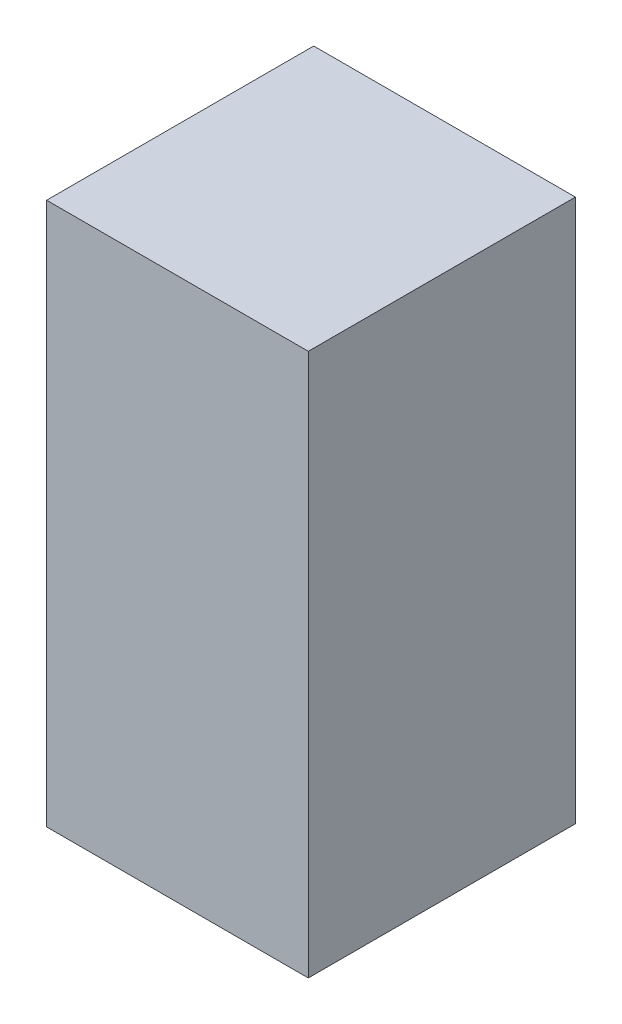
ISO-10303-21;
HEADER;
FILE_DESCRIPTION(('STEP AP214'),'2;1');
FILE_NAME('part.step','',(''),(''),'','','');
FILE_SCHEMA(('AUTOMOTIVE_DESIGN { 1 0 10303 214 1 1 1 1 }'));
ENDSEC;
DATA;
#1=APPLICATION_CONTEXT('core data for automotive mechanical design processes');
#2=APPLICATION_PROTOCOL_DEFINITION('international standard','automotive_design',2000,#1);
#3=PRODUCT_CONTEXT('',#1,'mechanical');
#4=PRODUCT('Part','Part','',(#3));
#5=PRODUCT_RELATED_PRODUCT_CATEGORY('part','',(#4));
#6=PRODUCT_DEFINITION_FORMATION('','',#4);
#7=PRODUCT_DEFINITION_CONTEXT('part definition',#1,'design');
#8=PRODUCT_DEFINITION('design','',#6,#7);
#9=PRODUCT_DEFINITION_SHAPE('','',#8);
#10=(LENGTH_UNIT() NAMED_UNIT(*) SI_UNIT(.MILLI.,.METRE.));
#11=(NAMED_UNIT(*) PLANE_ANGLE_UNIT() SI_UNIT($,.RADIAN.));
#12=(NAMED_UNIT(*) SI_UNIT($,.STERADIAN.) SOLID_ANGLE_UNIT());
#13=UNCERTAINTY_MEASURE_WITH_UNIT(LENGTH_MEASURE(1.E-05),#10,'distance_accuracy_value','');
#14=(GEOMETRIC_REPRESENTATION_CONTEXT(3) GLOBAL_UNCERTAINTY_ASSIGNED_CONTEXT((#13)) GLOBAL_UNIT_ASSIGNED_CONTEXT((#10,
#11,#12)) REPRESENTATION_CONTEXT('',''));
#15=CARTESIAN_POINT('',(0.,0.,0.));
#16=DIRECTION('',(0.,0.,1.));
#17=DIRECTION('',(1.,0.,0.));
#18=AXIS2_PLACEMENT_3D('',#15,#16,#17);
#19=CARTESIAN_POINT('',(-0.3429,0.7112,0.));
#20=DIRECTION('',(1.,0.,0.));
#21=DIRECTION('',(0.,0.,-1.));
#22=AXIS2_PLACEMENT_3D('',#19,#20,#21);
#23=PLANE('',#22);
#24=DIRECTION('',(0.,0.,1.));
#25=VECTOR('',#24,1.);
#26=CARTESIAN_POINT('',(-0.3429,-0.7112,0.));
#27=LINE('',#26,#25);
#28=CARTESIAN_POINT('',(-0.3429,-0.7112,0.));
#29=VERTEX_POINT('',#28);
#30=CARTESIAN_POINT('',(-0.3429,-0.7112,0.70000114));
#31=VERTEX_POINT('',#30);
#32=EDGE_CURVE('E20',#29,#31,#27,.T.);
#33=ORIENTED_EDGE('',*,*,#32,.T.);
#34=DIRECTION('',(0.,1.,0.));
#35=VECTOR('',#34,1.);
#36=CARTESIAN_POINT('',(-0.3429,-0.7112,0.70000114));
#37=LINE('',#36,#35);
#38=CARTESIAN_POINT('',(-0.3429,0.7112,0.70000114));
#39=VERTEX_POINT('',#38);
#40=EDGE_CURVE('E55',#31,#39,#37,.T.);
#41=ORIENTED_EDGE('',*,*,#40,.T.);
#42=DIRECTION('',(0.,0.,-1.));
#43=VECTOR('',#42,1.);
#44=CARTESIAN_POINT('',(-0.3429,0.7112,0.));
#45=LINE('',#44,#43);
#46=CARTESIAN_POINT('',(-0.3429,0.7112,0.));
#47=VERTEX_POINT('',#46);
#48=EDGE_CURVE('E74',#39,#47,#45,.T.);
#49=ORIENTED_EDGE('',*,*,#48,.T.);
#50=DIRECTION('',(0.,1.,0.));
#51=VECTOR('',#50,1.);
#52=CARTESIAN_POINT('',(-0.3429,-0.7112,0.));
#53=LINE('',#52,#51);
#54=EDGE_CURVE('E66',#29,#47,#53,.T.);
#55=ORIENTED_EDGE('',*,*,#54,.F.);
#56=EDGE_LOOP('',(#33,#41,#49,#55));
#57=FACE_BOUND('',#56,.T.);
#58=ADVANCED_FACE('F17',(#57),#23,.F.);
#59=CARTESIAN_POINT('',(-0.3429,-0.7112,0.));
#60=DIRECTION('',(0.,1.,0.));
#61=DIRECTION('',(0.,0.,1.));
#62=AXIS2_PLACEMENT_3D('',#59,#60,#61);
#63=PLANE('',#62);
#64=DIRECTION('',(0.,0.,1.));
#65=VECTOR('',#64,1.);
#66=CARTESIAN_POINT('',(0.3429,-0.7112,0.));
#67=LINE('',#66,#65);
#68=CARTESIAN_POINT('',(0.3429,-0.7112,0.));
#69=VERTEX_POINT('',#68);
#70=CARTESIAN_POINT('',(0.3429,-0.7112,0.70000114));
#71=VERTEX_POINT('',#70);
#72=EDGE_CURVE('E72',#69,#71,#67,.T.);
#73=ORIENTED_EDGE('',*,*,#72,.T.);
#74=DIRECTION('',(-1.,0.,0.));
#75=VECTOR('',#74,1.);
#76=CARTESIAN_POINT('',(-0.3429,-0.7112,0.70000114));
#77=LINE('',#76,#75);
#78=EDGE_CURVE('E62',#71,#31,#77,.T.);
#79=ORIENTED_EDGE('',*,*,#78,.T.);
#80=ORIENTED_EDGE('',*,*,#32,.F.);
#81=DIRECTION('',(-1.,0.,0.));
#82=VECTOR('',#81,1.);
#83=CARTESIAN_POINT('',(-0.3429,-0.7112,0.));
#84=LINE('',#83,#82);
#85=EDGE_CURVE('E80',#69,#29,#84,.T.);
#86=ORIENTED_EDGE('',*,*,#85,.F.);
#87=EDGE_LOOP('',(#73,#79,#80,#86));
#88=FACE_BOUND('',#87,.T.);
#89=ADVANCED_FACE('F71',(#88),#63,.F.);
#90=CARTESIAN_POINT('',(-0.3429,-0.7112,0.70000114));
#91=DIRECTION('',(0.,0.,-1.));
#92=DIRECTION('',(-1.,0.,0.));
#93=AXIS2_PLACEMENT_3D('',#90,#91,#92);
#94=PLANE('',#93);
#95=DIRECTION('',(0.,1.,0.));
#96=VECTOR('',#95,1.);
#97=CARTESIAN_POINT('',(0.3429,-0.7112,0.70000114));
#98=LINE('',#97,#96);
#99=CARTESIAN_POINT('',(0.3429,0.7112,0.70000114));
#100=VERTEX_POINT('',#99);
#101=EDGE_CURVE('E83',#71,#100,#98,.T.);
#102=ORIENTED_EDGE('',*,*,#101,.T.);
#103=DIRECTION('',(1.,0.,0.));
#104=VECTOR('',#103,1.);
#105=CARTESIAN_POINT('',(0.3429,0.7112,0.70000114));
#106=LINE('',#105,#104);
#107=EDGE_CURVE('E64',#100,#39,#106,.F.);
#108=ORIENTED_EDGE('',*,*,#107,.T.);
#109=ORIENTED_EDGE('',*,*,#40,.F.);
#110=ORIENTED_EDGE('',*,*,#78,.F.);
#111=EDGE_LOOP('',(#102,#108,#109,#110));
#112=FACE_BOUND('',#111,.T.);
#113=ADVANCED_FACE('F60',(#112),#94,.F.);
#114=CARTESIAN_POINT('',(0.3429,0.7112,0.));
#115=DIRECTION('',(0.,-1.,0.));
#116=DIRECTION('',(0.,0.,-1.));
#117=AXIS2_PLACEMENT_3D('',#114,#115,#116);
#118=PLANE('',#117);
#119=ORIENTED_EDGE('',*,*,#48,.F.);
#120=ORIENTED_EDGE('',*,*,#107,.F.);
#121=DIRECTION('',(0.,0.,1.));
#122=VECTOR('',#121,1.);
#123=CARTESIAN_POINT('',(0.3429,0.7112,0.));
#124=LINE('',#123,#122);
#125=CARTESIAN_POINT('',(0.3429,0.7112,0.));
#126=VERTEX_POINT('',#125);
#127=EDGE_CURVE('E26',#100,#126,#124,.F.);
#128=ORIENTED_EDGE('',*,*,#127,.T.);
#129=DIRECTION('',(-1.,0.,0.));
#130=VECTOR('',#129,1.);
#131=CARTESIAN_POINT('',(-0.3429,0.7112,0.));
#132=LINE('',#131,#130);
#133=EDGE_CURVE('E34',#47,#126,#132,.F.);
#134=ORIENTED_EDGE('',*,*,#133,.F.);
#135=EDGE_LOOP('',(#119,#120,#128,#134));
#136=FACE_BOUND('',#135,.T.);
#137=ADVANCED_FACE('F88',(#136),#118,.F.);
#138=CARTESIAN_POINT('',(-0.3429,-0.7112,0.));
#139=DIRECTION('',(0.,0.,-1.));
#140=DIRECTION('',(-1.,0.,0.));
#141=AXIS2_PLACEMENT_3D('',#138,#139,#140);
#142=PLANE('',#141);
#143=DIRECTION('',(0.,1.,0.));
#144=VECTOR('',#143,1.);
#145=CARTESIAN_POINT('',(0.3429,-0.7112,0.));
#146=LINE('',#145,#144);
#147=EDGE_CURVE('E11',#126,#69,#146,.F.);
#148=ORIENTED_EDGE('',*,*,#147,.T.);
#149=ORIENTED_EDGE('',*,*,#85,.T.);
#150=ORIENTED_EDGE('',*,*,#54,.T.);
#151=ORIENTED_EDGE('',*,*,#133,.T.);
#152=EDGE_LOOP('',(#148,#149,#150,#151));
#153=FACE_BOUND('',#152,.T.);
#154=ADVANCED_FACE('F91',(#153),#142,.T.);
#155=CARTESIAN_POINT('',(0.3429,-0.7112,0.));
#156=DIRECTION('',(-1.,0.,0.));
#157=DIRECTION('',(0.,0.,1.));
#158=AXIS2_PLACEMENT_3D('',#155,#156,#157);
#159=PLANE('',#158);
#160=ORIENTED_EDGE('',*,*,#127,.F.);
#161=ORIENTED_EDGE('',*,*,#101,.F.);
#162=ORIENTED_EDGE('',*,*,#72,.F.);
#163=ORIENTED_EDGE('',*,*,#147,.F.);
#164=EDGE_LOOP('',(#160,#161,#162,#163));
#165=FACE_BOUND('',#164,.T.);
#166=ADVANCED_FACE('F90',(#165),#159,.F.);
#167=CLOSED_SHELL('',(#58,#89,#113,#137,#154,#166));
#168=MANIFOLD_SOLID_BREP('B1',#167);
#169=ADVANCED_BREP_SHAPE_REPRESENTATION('',(#18,#168),#14);
#170=SHAPE_DEFINITION_REPRESENTATION(#9,#169);
ENDSEC;
END-ISO-10303-21;
